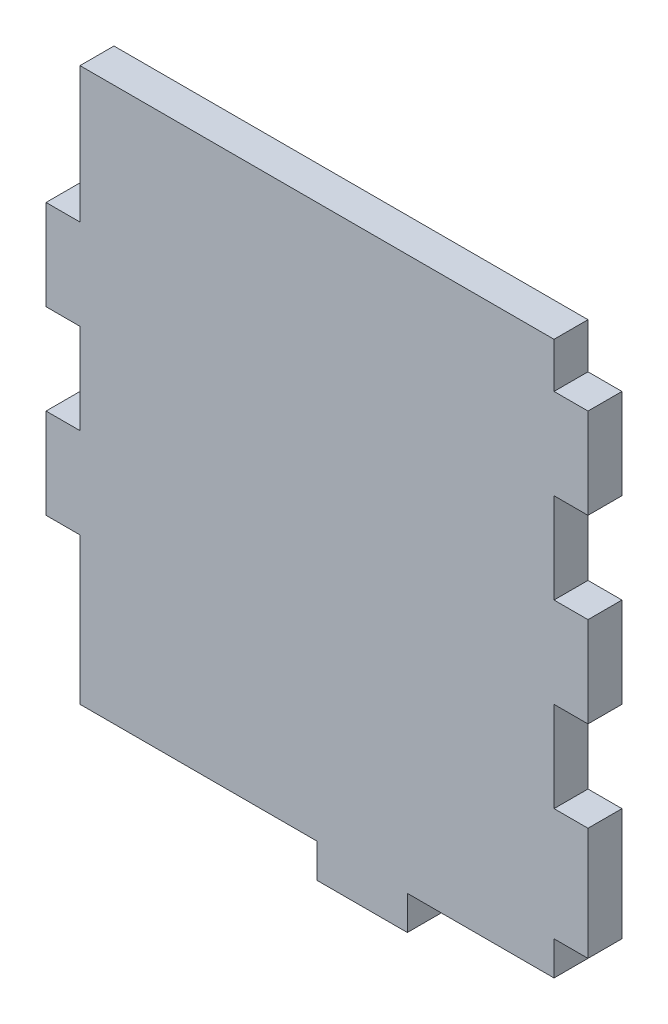
ISO-10303-21;
HEADER;
FILE_DESCRIPTION(('STEP AP214'),'2;1');
FILE_NAME('part.step','',(''),(''),'','','');
FILE_SCHEMA(('AUTOMOTIVE_DESIGN { 1 0 10303 214 1 1 1 1 }'));
ENDSEC;
DATA;
#1=APPLICATION_CONTEXT('core data for automotive mechanical design processes');
#2=APPLICATION_PROTOCOL_DEFINITION('international standard','automotive_design',2000,#1);
#3=PRODUCT_CONTEXT('',#1,'mechanical');
#4=PRODUCT('Part','Part','',(#3));
#5=PRODUCT_RELATED_PRODUCT_CATEGORY('part','',(#4));
#6=PRODUCT_DEFINITION_FORMATION('','',#4);
#7=PRODUCT_DEFINITION_CONTEXT('part definition',#1,'design');
#8=PRODUCT_DEFINITION('design','',#6,#7);
#9=PRODUCT_DEFINITION_SHAPE('','',#8);
#10=(LENGTH_UNIT() NAMED_UNIT(*) SI_UNIT(.MILLI.,.METRE.));
#11=(NAMED_UNIT(*) PLANE_ANGLE_UNIT() SI_UNIT($,.RADIAN.));
#12=(NAMED_UNIT(*) SI_UNIT($,.STERADIAN.) SOLID_ANGLE_UNIT());
#13=UNCERTAINTY_MEASURE_WITH_UNIT(LENGTH_MEASURE(1.E-05),#10,'distance_accuracy_value','');
#14=(GEOMETRIC_REPRESENTATION_CONTEXT(3) GLOBAL_UNCERTAINTY_ASSIGNED_CONTEXT((#13)) GLOBAL_UNIT_ASSIGNED_CONTEXT((#10,
#11,#12)) REPRESENTATION_CONTEXT('',''));
#15=CARTESIAN_POINT('',(0.,0.,0.));
#16=DIRECTION('',(0.,0.,1.));
#17=DIRECTION('',(1.,0.,0.));
#18=AXIS2_PLACEMENT_3D('',#15,#16,#17);
#19=CARTESIAN_POINT('',(0.,0.,4.7752));
#20=DIRECTION('',(0.,0.,-1.));
#21=DIRECTION('',(-1.,0.,0.));
#22=AXIS2_PLACEMENT_3D('',#19,#20,#21);
#23=PLANE('',#22);
#24=DIRECTION('',(0.,1.,0.));
#25=VECTOR('',#24,1.);
#26=CARTESIAN_POINT('',(71.4248,0.,4.7752));
#27=LINE('',#26,#25);
#28=CARTESIAN_POINT('',(71.4248,4.7752,4.7752));
#29=VERTEX_POINT('',#28);
#30=CARTESIAN_POINT('',(71.4248,9.5504,4.7752));
#31=VERTEX_POINT('',#30);
#32=EDGE_CURVE('E237',#29,#31,#27,.T.);
#33=ORIENTED_EDGE('',*,*,#32,.T.);
#34=DIRECTION('',(-1.,0.,0.));
#35=VECTOR('',#34,1.);
#36=CARTESIAN_POINT('',(0.,9.5504,4.7752));
#37=LINE('',#36,#35);
#38=CARTESIAN_POINT('',(76.2,9.5504,4.7752));
#39=VERTEX_POINT('',#38);
#40=EDGE_CURVE('E254',#39,#31,#37,.T.);
#41=ORIENTED_EDGE('',*,*,#40,.F.);
#42=DIRECTION('',(0.,1.,0.));
#43=VECTOR('',#42,1.);
#44=CARTESIAN_POINT('',(76.2,0.,4.7752));
#45=LINE('',#44,#43);
#46=CARTESIAN_POINT('',(76.2,25.4,4.7752));
#47=VERTEX_POINT('',#46);
#48=EDGE_CURVE('E55',#39,#47,#45,.T.);
#49=ORIENTED_EDGE('',*,*,#48,.T.);
#50=DIRECTION('',(-1.,0.,0.));
#51=VECTOR('',#50,1.);
#52=CARTESIAN_POINT('',(0.,25.4,4.7752));
#53=LINE('',#52,#51);
#54=CARTESIAN_POINT('',(71.4248,25.4,4.7752));
#55=VERTEX_POINT('',#54);
#56=EDGE_CURVE('E71',#47,#55,#53,.T.);
#57=ORIENTED_EDGE('',*,*,#56,.T.);
#58=DIRECTION('',(0.,1.,0.));
#59=VECTOR('',#58,1.);
#60=CARTESIAN_POINT('',(71.4248,0.,4.7752));
#61=LINE('',#60,#59);
#62=CARTESIAN_POINT('',(71.4248,38.1,4.7752));
#63=VERTEX_POINT('',#62);
#64=EDGE_CURVE('E519',#55,#63,#61,.T.);
#65=ORIENTED_EDGE('',*,*,#64,.T.);
#66=DIRECTION('',(-1.,0.,0.));
#67=VECTOR('',#66,1.);
#68=CARTESIAN_POINT('',(0.,38.1,4.7752));
#69=LINE('',#68,#67);
#70=CARTESIAN_POINT('',(76.2,38.1,4.7752));
#71=VERTEX_POINT('',#70);
#72=EDGE_CURVE('E602',#71,#63,#69,.T.);
#73=ORIENTED_EDGE('',*,*,#72,.F.);
#74=CARTESIAN_POINT('',(76.2,50.8,4.7752));
#75=VERTEX_POINT('',#74);
#76=EDGE_CURVE('E295',#71,#75,#45,.T.);
#77=ORIENTED_EDGE('',*,*,#76,.T.);
#78=DIRECTION('',(-1.,0.,0.));
#79=VECTOR('',#78,1.);
#80=CARTESIAN_POINT('',(0.,50.8,4.7752));
#81=LINE('',#80,#79);
#82=CARTESIAN_POINT('',(71.4248,50.8,4.7752));
#83=VERTEX_POINT('',#82);
#84=EDGE_CURVE('E63',#75,#83,#81,.T.);
#85=ORIENTED_EDGE('',*,*,#84,.T.);
#86=DIRECTION('',(0.,1.,0.));
#87=VECTOR('',#86,1.);
#88=CARTESIAN_POINT('',(71.4248,0.,4.7752));
#89=LINE('',#88,#87);
#90=CARTESIAN_POINT('',(71.4248,63.5,4.7752));
#91=VERTEX_POINT('',#90);
#92=EDGE_CURVE('E503',#83,#91,#89,.T.);
#93=ORIENTED_EDGE('',*,*,#92,.T.);
#94=DIRECTION('',(-1.,0.,0.));
#95=VECTOR('',#94,1.);
#96=CARTESIAN_POINT('',(0.,63.5,4.7752));
#97=LINE('',#96,#95);
#98=CARTESIAN_POINT('',(76.2,63.5,4.7752));
#99=VERTEX_POINT('',#98);
#100=EDGE_CURVE('E501',#99,#91,#97,.T.);
#101=ORIENTED_EDGE('',*,*,#100,.F.);
#102=CARTESIAN_POINT('',(76.2,76.2,4.7752));
#103=VERTEX_POINT('',#102);
#104=EDGE_CURVE('E292',#99,#103,#45,.T.);
#105=ORIENTED_EDGE('',*,*,#104,.T.);
#106=DIRECTION('',(-1.,0.,0.));
#107=VECTOR('',#106,1.);
#108=CARTESIAN_POINT('',(0.,76.2,4.7752));
#109=LINE('',#108,#107);
#110=CARTESIAN_POINT('',(71.4248,76.2,4.7752));
#111=VERTEX_POINT('',#110);
#112=EDGE_CURVE('E498',#103,#111,#109,.T.);
#113=ORIENTED_EDGE('',*,*,#112,.T.);
#114=DIRECTION('',(0.,1.,0.));
#115=VECTOR('',#114,1.);
#116=CARTESIAN_POINT('',(71.4248,0.,4.7752));
#117=LINE('',#116,#115);
#118=CARTESIAN_POINT('',(71.4248,82.55,4.7752));
#119=VERTEX_POINT('',#118);
#120=EDGE_CURVE('E536',#111,#119,#117,.T.);
#121=ORIENTED_EDGE('',*,*,#120,.T.);
#122=DIRECTION('',(-1.,0.,0.));
#123=VECTOR('',#122,1.);
#124=CARTESIAN_POINT('',(0.,82.55,4.7752));
#125=LINE('',#124,#123);
#126=CARTESIAN_POINT('',(4.77520000000001,82.55,4.7752));
#127=VERTEX_POINT('',#126);
#128=EDGE_CURVE('E11',#119,#127,#125,.T.);
#129=ORIENTED_EDGE('',*,*,#128,.T.);
#130=DIRECTION('',(0.,1.,0.));
#131=VECTOR('',#130,1.);
#132=CARTESIAN_POINT('',(4.77519999999997,0.,4.7752));
#133=LINE('',#132,#131);
#134=CARTESIAN_POINT('',(4.7752,63.5,4.7752));
#135=VERTEX_POINT('',#134);
#136=EDGE_CURVE('E340',#135,#127,#133,.T.);
#137=ORIENTED_EDGE('',*,*,#136,.F.);
#138=DIRECTION('',(1.,0.,0.));
#139=VECTOR('',#138,1.);
#140=CARTESIAN_POINT('',(0.,63.5,4.7752));
#141=LINE('',#140,#139);
#142=CARTESIAN_POINT('',(0.,63.5,4.7752));
#143=VERTEX_POINT('',#142);
#144=EDGE_CURVE('E354',#143,#135,#141,.T.);
#145=ORIENTED_EDGE('',*,*,#144,.F.);
#146=DIRECTION('',(0.,-1.,0.));
#147=VECTOR('',#146,1.);
#148=CARTESIAN_POINT('',(0.,0.,4.7752));
#149=LINE('',#148,#147);
#150=CARTESIAN_POINT('',(0.,50.8,4.7752));
#151=VERTEX_POINT('',#150);
#152=EDGE_CURVE('E287',#143,#151,#149,.T.);
#153=ORIENTED_EDGE('',*,*,#152,.T.);
#154=DIRECTION('',(1.,0.,0.));
#155=VECTOR('',#154,1.);
#156=CARTESIAN_POINT('',(0.,50.8,4.7752));
#157=LINE('',#156,#155);
#158=CARTESIAN_POINT('',(4.7752,50.8,4.7752));
#159=VERTEX_POINT('',#158);
#160=EDGE_CURVE('E368',#151,#159,#157,.T.);
#161=ORIENTED_EDGE('',*,*,#160,.T.);
#162=DIRECTION('',(0.,1.,0.));
#163=VECTOR('',#162,1.);
#164=CARTESIAN_POINT('',(4.7752,0.,4.7752));
#165=LINE('',#164,#163);
#166=CARTESIAN_POINT('',(4.7752,38.1,4.7752));
#167=VERTEX_POINT('',#166);
#168=EDGE_CURVE('E380',#167,#159,#165,.T.);
#169=ORIENTED_EDGE('',*,*,#168,.F.);
#170=DIRECTION('',(1.,0.,0.));
#171=VECTOR('',#170,1.);
#172=CARTESIAN_POINT('',(0.,38.1,4.7752));
#173=LINE('',#172,#171);
#174=CARTESIAN_POINT('',(0.,38.1,4.7752));
#175=VERTEX_POINT('',#174);
#176=EDGE_CURVE('E376',#175,#167,#173,.T.);
#177=ORIENTED_EDGE('',*,*,#176,.F.);
#178=CARTESIAN_POINT('',(0.,25.4,4.7752));
#179=VERTEX_POINT('',#178);
#180=EDGE_CURVE('E283',#175,#179,#149,.T.);
#181=ORIENTED_EDGE('',*,*,#180,.T.);
#182=DIRECTION('',(1.,0.,0.));
#183=VECTOR('',#182,1.);
#184=CARTESIAN_POINT('',(0.,25.4,4.7752));
#185=LINE('',#184,#183);
#186=CARTESIAN_POINT('',(4.7752,25.4,4.7752));
#187=VERTEX_POINT('',#186);
#188=EDGE_CURVE('E404',#179,#187,#185,.T.);
#189=ORIENTED_EDGE('',*,*,#188,.T.);
#190=DIRECTION('',(0.,1.,0.));
#191=VECTOR('',#190,1.);
#192=CARTESIAN_POINT('',(4.7752,0.,4.7752));
#193=LINE('',#192,#191);
#194=CARTESIAN_POINT('',(4.7752,4.7752,4.7752));
#195=VERTEX_POINT('',#194);
#196=EDGE_CURVE('E408',#195,#187,#193,.T.);
#197=ORIENTED_EDGE('',*,*,#196,.F.);
#198=DIRECTION('',(-1.,0.,0.));
#199=VECTOR('',#198,1.);
#200=CARTESIAN_POINT('',(0.,4.7752,4.7752));
#201=LINE('',#200,#199);
#202=CARTESIAN_POINT('',(38.1,4.7752,4.7752));
#203=VERTEX_POINT('',#202);
#204=EDGE_CURVE('E429',#203,#195,#201,.T.);
#205=ORIENTED_EDGE('',*,*,#204,.F.);
#206=DIRECTION('',(0.,1.,0.));
#207=VECTOR('',#206,1.);
#208=CARTESIAN_POINT('',(38.1,-1.10727030381498E-13,4.7752));
#209=LINE('',#208,#207);
#210=CARTESIAN_POINT('',(38.1,0.,4.7752));
#211=VERTEX_POINT('',#210);
#212=EDGE_CURVE('E280',#211,#203,#209,.T.);
#213=ORIENTED_EDGE('',*,*,#212,.F.);
#214=DIRECTION('',(1.,0.,0.));
#215=VECTOR('',#214,1.);
#216=CARTESIAN_POINT('',(0.,0.,4.7752));
#217=LINE('',#216,#215);
#218=CARTESIAN_POINT('',(50.8,0.,4.7752));
#219=VERTEX_POINT('',#218);
#220=EDGE_CURVE('E288',#211,#219,#217,.T.);
#221=ORIENTED_EDGE('',*,*,#220,.T.);
#222=DIRECTION('',(0.,1.,0.));
#223=VECTOR('',#222,1.);
#224=CARTESIAN_POINT('',(50.8,0.,4.7752));
#225=LINE('',#224,#223);
#226=CARTESIAN_POINT('',(50.8,4.7752,4.7752));
#227=VERTEX_POINT('',#226);
#228=EDGE_CURVE('E261',#219,#227,#225,.T.);
#229=ORIENTED_EDGE('',*,*,#228,.T.);
#230=DIRECTION('',(1.,0.,0.));
#231=VECTOR('',#230,1.);
#232=CARTESIAN_POINT('',(0.,4.7752,4.7752));
#233=LINE('',#232,#231);
#234=EDGE_CURVE('E267',#227,#29,#233,.T.);
#235=ORIENTED_EDGE('',*,*,#234,.T.);
#236=EDGE_LOOP('',(#33,#41,#49,#57,#65,#73,#77,#85,#93,#101,#105,#113,#121,#129,#137,#145,#153,
#161,#169,#177,#181,#189,#197,#205,#213,#221,#229,#235));
#237=FACE_BOUND('',#236,.T.);
#238=ADVANCED_FACE('F45',(#237),#23,.F.);
#239=CARTESIAN_POINT('',(0.,0.,0.));
#240=DIRECTION('',(0.,0.,-1.));
#241=DIRECTION('',(-1.,0.,0.));
#242=AXIS2_PLACEMENT_3D('',#239,#240,#241);
#243=PLANE('',#242);
#244=DIRECTION('',(-1.,0.,0.));
#245=VECTOR('',#244,1.);
#246=CARTESIAN_POINT('',(0.,9.5504,0.));
#247=LINE('',#246,#245);
#248=CARTESIAN_POINT('',(76.2,9.5504,0.));
#249=VERTEX_POINT('',#248);
#250=CARTESIAN_POINT('',(71.4248,9.5504,0.));
#251=VERTEX_POINT('',#250);
#252=EDGE_CURVE('E244',#249,#251,#247,.T.);
#253=ORIENTED_EDGE('',*,*,#252,.T.);
#254=DIRECTION('',(0.,1.,0.));
#255=VECTOR('',#254,1.);
#256=CARTESIAN_POINT('',(71.4248,0.,0.));
#257=LINE('',#256,#255);
#258=CARTESIAN_POINT('',(71.4248,4.7752,0.));
#259=VERTEX_POINT('',#258);
#260=EDGE_CURVE('E234',#259,#251,#257,.T.);
#261=ORIENTED_EDGE('',*,*,#260,.F.);
#262=DIRECTION('',(1.,0.,0.));
#263=VECTOR('',#262,1.);
#264=CARTESIAN_POINT('',(0.,4.7752,0.));
#265=LINE('',#264,#263);
#266=CARTESIAN_POINT('',(50.8,4.7752,0.));
#267=VERTEX_POINT('',#266);
#268=EDGE_CURVE('E251',#267,#259,#265,.T.);
#269=ORIENTED_EDGE('',*,*,#268,.F.);
#270=DIRECTION('',(0.,1.,0.));
#271=VECTOR('',#270,1.);
#272=CARTESIAN_POINT('',(50.8,0.,0.));
#273=LINE('',#272,#271);
#274=CARTESIAN_POINT('',(50.8,0.,0.));
#275=VERTEX_POINT('',#274);
#276=EDGE_CURVE('E260',#275,#267,#273,.T.);
#277=ORIENTED_EDGE('',*,*,#276,.F.);
#278=DIRECTION('',(1.,0.,0.));
#279=VECTOR('',#278,1.);
#280=CARTESIAN_POINT('',(0.,0.,0.));
#281=LINE('',#280,#279);
#282=CARTESIAN_POINT('',(38.1,0.,0.));
#283=VERTEX_POINT('',#282);
#284=EDGE_CURVE('E303',#283,#275,#281,.T.);
#285=ORIENTED_EDGE('',*,*,#284,.F.);
#286=DIRECTION('',(0.,1.,0.));
#287=VECTOR('',#286,1.);
#288=CARTESIAN_POINT('',(38.1,-1.10727030381498E-13,0.));
#289=LINE('',#288,#287);
#290=CARTESIAN_POINT('',(38.1,4.7752,0.));
#291=VERTEX_POINT('',#290);
#292=EDGE_CURVE('E424',#283,#291,#289,.T.);
#293=ORIENTED_EDGE('',*,*,#292,.T.);
#294=DIRECTION('',(-1.,0.,0.));
#295=VECTOR('',#294,1.);
#296=CARTESIAN_POINT('',(0.,4.7752,0.));
#297=LINE('',#296,#295);
#298=CARTESIAN_POINT('',(4.7752,4.7752,0.));
#299=VERTEX_POINT('',#298);
#300=EDGE_CURVE('E428',#291,#299,#297,.T.);
#301=ORIENTED_EDGE('',*,*,#300,.T.);
#302=DIRECTION('',(0.,1.,0.));
#303=VECTOR('',#302,1.);
#304=CARTESIAN_POINT('',(4.7752,0.,0.));
#305=LINE('',#304,#303);
#306=CARTESIAN_POINT('',(4.7752,25.4,0.));
#307=VERTEX_POINT('',#306);
#308=EDGE_CURVE('E399',#299,#307,#305,.T.);
#309=ORIENTED_EDGE('',*,*,#308,.T.);
#310=DIRECTION('',(1.,0.,0.));
#311=VECTOR('',#310,1.);
#312=CARTESIAN_POINT('',(0.,25.4,0.));
#313=LINE('',#312,#311);
#314=CARTESIAN_POINT('',(0.,25.4,0.));
#315=VERTEX_POINT('',#314);
#316=EDGE_CURVE('E403',#315,#307,#313,.T.);
#317=ORIENTED_EDGE('',*,*,#316,.F.);
#318=DIRECTION('',(0.,-1.,0.));
#319=VECTOR('',#318,1.);
#320=CARTESIAN_POINT('',(0.,0.,0.));
#321=LINE('',#320,#319);
#322=CARTESIAN_POINT('',(0.,38.1,0.));
#323=VERTEX_POINT('',#322);
#324=EDGE_CURVE('E297',#323,#315,#321,.T.);
#325=ORIENTED_EDGE('',*,*,#324,.F.);
#326=DIRECTION('',(1.,0.,0.));
#327=VECTOR('',#326,1.);
#328=CARTESIAN_POINT('',(0.,38.1,0.));
#329=LINE('',#328,#327);
#330=CARTESIAN_POINT('',(4.7752,38.1,0.));
#331=VERTEX_POINT('',#330);
#332=EDGE_CURVE('E363',#323,#331,#329,.T.);
#333=ORIENTED_EDGE('',*,*,#332,.T.);
#334=DIRECTION('',(0.,1.,0.));
#335=VECTOR('',#334,1.);
#336=CARTESIAN_POINT('',(4.7752,0.,0.));
#337=LINE('',#336,#335);
#338=CARTESIAN_POINT('',(4.7752,50.8,0.));
#339=VERTEX_POINT('',#338);
#340=EDGE_CURVE('E367',#331,#339,#337,.T.);
#341=ORIENTED_EDGE('',*,*,#340,.T.);
#342=DIRECTION('',(1.,0.,0.));
#343=VECTOR('',#342,1.);
#344=CARTESIAN_POINT('',(0.,50.8,0.));
#345=LINE('',#344,#343);
#346=CARTESIAN_POINT('',(0.,50.8,0.));
#347=VERTEX_POINT('',#346);
#348=EDGE_CURVE('E372',#347,#339,#345,.T.);
#349=ORIENTED_EDGE('',*,*,#348,.F.);
#350=CARTESIAN_POINT('',(0.,63.5,0.));
#351=VERTEX_POINT('',#350);
#352=EDGE_CURVE('E301',#351,#347,#321,.T.);
#353=ORIENTED_EDGE('',*,*,#352,.F.);
#354=DIRECTION('',(1.,0.,0.));
#355=VECTOR('',#354,1.);
#356=CARTESIAN_POINT('',(0.,63.5,0.));
#357=LINE('',#356,#355);
#358=CARTESIAN_POINT('',(4.7752,63.5,0.));
#359=VERTEX_POINT('',#358);
#360=EDGE_CURVE('E345',#351,#359,#357,.T.);
#361=ORIENTED_EDGE('',*,*,#360,.T.);
#362=DIRECTION('',(0.,1.,0.));
#363=VECTOR('',#362,1.);
#364=CARTESIAN_POINT('',(4.77519999999997,0.,0.));
#365=LINE('',#364,#363);
#366=CARTESIAN_POINT('',(4.77520000000001,82.55,0.));
#367=VERTEX_POINT('',#366);
#368=EDGE_CURVE('E337',#359,#367,#365,.T.);
#369=ORIENTED_EDGE('',*,*,#368,.T.);
#370=DIRECTION('',(-1.,0.,0.));
#371=VECTOR('',#370,1.);
#372=CARTESIAN_POINT('',(0.,82.55,0.));
#373=LINE('',#372,#371);
#374=CARTESIAN_POINT('',(71.4248,82.55,0.));
#375=VERTEX_POINT('',#374);
#376=EDGE_CURVE('E49',#375,#367,#373,.T.);
#377=ORIENTED_EDGE('',*,*,#376,.F.);
#378=DIRECTION('',(0.,1.,0.));
#379=VECTOR('',#378,1.);
#380=CARTESIAN_POINT('',(71.4248,0.,0.));
#381=LINE('',#380,#379);
#382=CARTESIAN_POINT('',(71.4248,76.2,0.));
#383=VERTEX_POINT('',#382);
#384=EDGE_CURVE('E529',#383,#375,#381,.T.);
#385=ORIENTED_EDGE('',*,*,#384,.F.);
#386=DIRECTION('',(-1.,0.,0.));
#387=VECTOR('',#386,1.);
#388=CARTESIAN_POINT('',(0.,76.2,0.));
#389=LINE('',#388,#387);
#390=CARTESIAN_POINT('',(76.2,76.2,0.));
#391=VERTEX_POINT('',#390);
#392=EDGE_CURVE('E532',#391,#383,#389,.T.);
#393=ORIENTED_EDGE('',*,*,#392,.F.);
#394=DIRECTION('',(0.,1.,0.));
#395=VECTOR('',#394,1.);
#396=CARTESIAN_POINT('',(76.2,0.,0.));
#397=LINE('',#396,#395);
#398=CARTESIAN_POINT('',(76.2,63.5,0.));
#399=VERTEX_POINT('',#398);
#400=EDGE_CURVE('E306',#399,#391,#397,.T.);
#401=ORIENTED_EDGE('',*,*,#400,.F.);
#402=DIRECTION('',(-1.,0.,0.));
#403=VECTOR('',#402,1.);
#404=CARTESIAN_POINT('',(0.,63.5,0.));
#405=LINE('',#404,#403);
#406=CARTESIAN_POINT('',(71.4248,63.5,0.));
#407=VERTEX_POINT('',#406);
#408=EDGE_CURVE('E528',#399,#407,#405,.T.);
#409=ORIENTED_EDGE('',*,*,#408,.T.);
#410=DIRECTION('',(0.,1.,0.));
#411=VECTOR('',#410,1.);
#412=CARTESIAN_POINT('',(71.4248,0.,0.));
#413=LINE('',#412,#411);
#414=CARTESIAN_POINT('',(71.4248,50.8,0.));
#415=VERTEX_POINT('',#414);
#416=EDGE_CURVE('E507',#415,#407,#413,.T.);
#417=ORIENTED_EDGE('',*,*,#416,.F.);
#418=DIRECTION('',(-1.,0.,0.));
#419=VECTOR('',#418,1.);
#420=CARTESIAN_POINT('',(0.,50.8,0.));
#421=LINE('',#420,#419);
#422=CARTESIAN_POINT('',(76.2,50.8,0.));
#423=VERTEX_POINT('',#422);
#424=EDGE_CURVE('E511',#423,#415,#421,.T.);
#425=ORIENTED_EDGE('',*,*,#424,.F.);
#426=CARTESIAN_POINT('',(76.2,38.1,0.));
#427=VERTEX_POINT('',#426);
#428=EDGE_CURVE('E309',#427,#423,#397,.T.);
#429=ORIENTED_EDGE('',*,*,#428,.F.);
#430=DIRECTION('',(-1.,0.,0.));
#431=VECTOR('',#430,1.);
#432=CARTESIAN_POINT('',(0.,38.1,0.));
#433=LINE('',#432,#431);
#434=CARTESIAN_POINT('',(71.4248,38.1,0.));
#435=VERTEX_POINT('',#434);
#436=EDGE_CURVE('E577',#427,#435,#433,.T.);
#437=ORIENTED_EDGE('',*,*,#436,.T.);
#438=DIRECTION('',(0.,1.,0.));
#439=VECTOR('',#438,1.);
#440=CARTESIAN_POINT('',(71.4248,0.,0.));
#441=LINE('',#440,#439);
#442=CARTESIAN_POINT('',(71.4248,25.4,0.));
#443=VERTEX_POINT('',#442);
#444=EDGE_CURVE('E605',#443,#435,#441,.T.);
#445=ORIENTED_EDGE('',*,*,#444,.F.);
#446=DIRECTION('',(-1.,0.,0.));
#447=VECTOR('',#446,1.);
#448=CARTESIAN_POINT('',(0.,25.4,0.));
#449=LINE('',#448,#447);
#450=CARTESIAN_POINT('',(76.2,25.4,0.));
#451=VERTEX_POINT('',#450);
#452=EDGE_CURVE('E609',#451,#443,#449,.T.);
#453=ORIENTED_EDGE('',*,*,#452,.F.);
#454=EDGE_CURVE('E310',#249,#451,#397,.T.);
#455=ORIENTED_EDGE('',*,*,#454,.F.);
#456=EDGE_LOOP('',(#253,#261,#269,#277,#285,#293,#301,#309,#317,#325,#333,#341,#349,#353,#361,
#369,#377,#385,#393,#401,#409,#417,#425,#429,#437,#445,#453,#455));
#457=FACE_BOUND('',#456,.T.);
#458=ADVANCED_FACE('F249',(#457),#243,.T.);
#459=CARTESIAN_POINT('',(76.2,0.,4.7752));
#460=DIRECTION('',(-1.,0.,0.));
#461=DIRECTION('',(0.,0.,1.));
#462=AXIS2_PLACEMENT_3D('',#459,#460,#461);
#463=PLANE('',#462);
#464=ORIENTED_EDGE('',*,*,#48,.F.);
#465=DIRECTION('',(0.,0.,1.));
#466=VECTOR('',#465,1.);
#467=CARTESIAN_POINT('',(76.2,9.5504,0.));
#468=LINE('',#467,#466);
#469=EDGE_CURVE('E243',#249,#39,#468,.T.);
#470=ORIENTED_EDGE('',*,*,#469,.F.);
#471=ORIENTED_EDGE('',*,*,#454,.T.);
#472=DIRECTION('',(0.,0.,1.));
#473=VECTOR('',#472,1.);
#474=CARTESIAN_POINT('',(76.2,25.4,0.));
#475=LINE('',#474,#473);
#476=EDGE_CURVE('E567',#451,#47,#475,.T.);
#477=ORIENTED_EDGE('',*,*,#476,.T.);
#478=EDGE_LOOP('',(#464,#470,#471,#477));
#479=FACE_BOUND('',#478,.T.);
#480=ADVANCED_FACE('F476',(#479),#463,.F.);
#481=ORIENTED_EDGE('',*,*,#76,.F.);
#482=DIRECTION('',(0.,0.,1.));
#483=VECTOR('',#482,1.);
#484=CARTESIAN_POINT('',(76.2,38.1,0.));
#485=LINE('',#484,#483);
#486=EDGE_CURVE('E570',#427,#71,#485,.T.);
#487=ORIENTED_EDGE('',*,*,#486,.F.);
#488=ORIENTED_EDGE('',*,*,#428,.T.);
#489=DIRECTION('',(0.,0.,1.));
#490=VECTOR('',#489,1.);
#491=CARTESIAN_POINT('',(76.2,50.8,0.));
#492=LINE('',#491,#490);
#493=EDGE_CURVE('E522',#423,#75,#492,.T.);
#494=ORIENTED_EDGE('',*,*,#493,.T.);
#495=EDGE_LOOP('',(#481,#487,#488,#494));
#496=FACE_BOUND('',#495,.T.);
#497=ADVANCED_FACE('F483',(#496),#463,.F.);
#498=ORIENTED_EDGE('',*,*,#104,.F.);
#499=DIRECTION('',(0.,0.,1.));
#500=VECTOR('',#499,1.);
#501=CARTESIAN_POINT('',(76.2,63.5,0.));
#502=LINE('',#501,#500);
#503=EDGE_CURVE('E493',#399,#99,#502,.T.);
#504=ORIENTED_EDGE('',*,*,#503,.F.);
#505=ORIENTED_EDGE('',*,*,#400,.T.);
#506=DIRECTION('',(0.,0.,1.));
#507=VECTOR('',#506,1.);
#508=CARTESIAN_POINT('',(76.2,76.2,0.));
#509=LINE('',#508,#507);
#510=EDGE_CURVE('E494',#391,#103,#509,.T.);
#511=ORIENTED_EDGE('',*,*,#510,.T.);
#512=EDGE_LOOP('',(#498,#504,#505,#511));
#513=FACE_BOUND('',#512,.T.);
#514=ADVANCED_FACE('F481',(#513),#463,.F.);
#515=CARTESIAN_POINT('',(0.,82.55,4.7752));
#516=DIRECTION('',(0.,-1.,0.));
#517=DIRECTION('',(0.,0.,-1.));
#518=AXIS2_PLACEMENT_3D('',#515,#516,#517);
#519=PLANE('',#518);
#520=DIRECTION('',(0.,0.,1.));
#521=VECTOR('',#520,1.);
#522=CARTESIAN_POINT('',(71.4248,82.55,0.));
#523=LINE('',#522,#521);
#524=EDGE_CURVE('E330',#375,#119,#523,.T.);
#525=ORIENTED_EDGE('',*,*,#524,.F.);
#526=ORIENTED_EDGE('',*,*,#376,.T.);
#527=DIRECTION('',(0.,0.,1.));
#528=VECTOR('',#527,1.);
#529=CARTESIAN_POINT('',(4.77520000000001,82.55,0.));
#530=LINE('',#529,#528);
#531=EDGE_CURVE('E329',#367,#127,#530,.T.);
#532=ORIENTED_EDGE('',*,*,#531,.T.);
#533=ORIENTED_EDGE('',*,*,#128,.F.);
#534=EDGE_LOOP('',(#525,#526,#532,#533));
#535=FACE_BOUND('',#534,.T.);
#536=ADVANCED_FACE('F327',(#535),#519,.F.);
#537=CARTESIAN_POINT('',(0.,4.7752,0.));
#538=DIRECTION('',(0.,-1.,0.));
#539=DIRECTION('',(0.,0.,-1.));
#540=AXIS2_PLACEMENT_3D('',#537,#538,#539);
#541=PLANE('',#540);
#542=ORIENTED_EDGE('',*,*,#268,.T.);
#543=DIRECTION('',(0.,0.,1.));
#544=VECTOR('',#543,1.);
#545=CARTESIAN_POINT('',(71.4248,4.7752,0.));
#546=LINE('',#545,#544);
#547=EDGE_CURVE('E231',#259,#29,#546,.T.);
#548=ORIENTED_EDGE('',*,*,#547,.T.);
#549=ORIENTED_EDGE('',*,*,#234,.F.);
#550=DIRECTION('',(0.,0.,1.));
#551=VECTOR('',#550,1.);
#552=CARTESIAN_POINT('',(50.8,4.7752,0.));
#553=LINE('',#552,#551);
#554=EDGE_CURVE('E258',#267,#227,#553,.T.);
#555=ORIENTED_EDGE('',*,*,#554,.F.);
#556=EDGE_LOOP('',(#542,#548,#549,#555));
#557=FACE_BOUND('',#556,.T.);
#558=ADVANCED_FACE('F257',(#557),#541,.T.);
#559=CARTESIAN_POINT('',(0.,0.,4.7752));
#560=DIRECTION('',(1.,0.,0.));
#561=DIRECTION('',(0.,0.,-1.));
#562=AXIS2_PLACEMENT_3D('',#559,#560,#561);
#563=PLANE('',#562);
#564=ORIENTED_EDGE('',*,*,#152,.F.);
#565=DIRECTION('',(0.,0.,1.));
#566=VECTOR('',#565,1.);
#567=CARTESIAN_POINT('',(0.,63.5,0.));
#568=LINE('',#567,#566);
#569=EDGE_CURVE('E274',#351,#143,#568,.T.);
#570=ORIENTED_EDGE('',*,*,#569,.F.);
#571=ORIENTED_EDGE('',*,*,#352,.T.);
#572=DIRECTION('',(0.,0.,1.));
#573=VECTOR('',#572,1.);
#574=CARTESIAN_POINT('',(0.,50.8,0.));
#575=LINE('',#574,#573);
#576=EDGE_CURVE('E390',#347,#151,#575,.T.);
#577=ORIENTED_EDGE('',*,*,#576,.T.);
#578=EDGE_LOOP('',(#564,#570,#571,#577));
#579=FACE_BOUND('',#578,.T.);
#580=ADVANCED_FACE('F47',(#579),#563,.F.);
#581=ORIENTED_EDGE('',*,*,#180,.F.);
#582=DIRECTION('',(0.,0.,1.));
#583=VECTOR('',#582,1.);
#584=CARTESIAN_POINT('',(0.,38.1,0.));
#585=LINE('',#584,#583);
#586=EDGE_CURVE('E358',#323,#175,#585,.T.);
#587=ORIENTED_EDGE('',*,*,#586,.F.);
#588=ORIENTED_EDGE('',*,*,#324,.T.);
#589=DIRECTION('',(0.,0.,1.));
#590=VECTOR('',#589,1.);
#591=CARTESIAN_POINT('',(0.,25.4,0.));
#592=LINE('',#591,#590);
#593=EDGE_CURVE('E381',#315,#179,#592,.T.);
#594=ORIENTED_EDGE('',*,*,#593,.T.);
#595=EDGE_LOOP('',(#581,#587,#588,#594));
#596=FACE_BOUND('',#595,.T.);
#597=ADVANCED_FACE('F468',(#596),#563,.F.);
#598=CARTESIAN_POINT('',(0.,0.,4.7752));
#599=DIRECTION('',(0.,1.,0.));
#600=DIRECTION('',(0.,0.,1.));
#601=AXIS2_PLACEMENT_3D('',#598,#599,#600);
#602=PLANE('',#601);
#603=ORIENTED_EDGE('',*,*,#220,.F.);
#604=DIRECTION('',(0.,0.,1.));
#605=VECTOR('',#604,1.);
#606=CARTESIAN_POINT('',(38.1,0.,0.));
#607=LINE('',#606,#605);
#608=EDGE_CURVE('E302',#283,#211,#607,.T.);
#609=ORIENTED_EDGE('',*,*,#608,.F.);
#610=ORIENTED_EDGE('',*,*,#284,.T.);
#611=DIRECTION('',(0.,0.,1.));
#612=VECTOR('',#611,1.);
#613=CARTESIAN_POINT('',(50.8,0.,0.));
#614=LINE('',#613,#612);
#615=EDGE_CURVE('E276',#275,#219,#614,.T.);
#616=ORIENTED_EDGE('',*,*,#615,.T.);
#617=EDGE_LOOP('',(#603,#609,#610,#616));
#618=FACE_BOUND('',#617,.T.);
#619=ADVANCED_FACE('F458',(#618),#602,.F.);
#620=CARTESIAN_POINT('',(50.8,0.,0.));
#621=DIRECTION('',(1.,0.,0.));
#622=DIRECTION('',(0.,0.,-1.));
#623=AXIS2_PLACEMENT_3D('',#620,#621,#622);
#624=PLANE('',#623);
#625=ORIENTED_EDGE('',*,*,#228,.F.);
#626=ORIENTED_EDGE('',*,*,#615,.F.);
#627=ORIENTED_EDGE('',*,*,#276,.T.);
#628=ORIENTED_EDGE('',*,*,#554,.T.);
#629=EDGE_LOOP('',(#625,#626,#627,#628));
#630=FACE_BOUND('',#629,.T.);
#631=ADVANCED_FACE('F460',(#630),#624,.T.);
#632=CARTESIAN_POINT('',(38.1,-1.10727030381498E-13,0.));
#633=DIRECTION('',(1.,0.,0.));
#634=DIRECTION('',(0.,1.,0.));
#635=AXIS2_PLACEMENT_3D('',#632,#633,#634);
#636=PLANE('',#635);
#637=ORIENTED_EDGE('',*,*,#212,.T.);
#638=DIRECTION('',(0.,0.,1.));
#639=VECTOR('',#638,1.);
#640=CARTESIAN_POINT('',(38.1,4.7752,0.));
#641=LINE('',#640,#639);
#642=EDGE_CURVE('E270',#291,#203,#641,.T.);
#643=ORIENTED_EDGE('',*,*,#642,.F.);
#644=ORIENTED_EDGE('',*,*,#292,.F.);
#645=ORIENTED_EDGE('',*,*,#608,.T.);
#646=EDGE_LOOP('',(#637,#643,#644,#645));
#647=FACE_BOUND('',#646,.T.);
#648=ADVANCED_FACE('F448',(#647),#636,.F.);
#649=CARTESIAN_POINT('',(0.,4.7752,0.));
#650=DIRECTION('',(0.,1.,0.));
#651=DIRECTION('',(-1.,0.,0.));
#652=AXIS2_PLACEMENT_3D('',#649,#650,#651);
#653=PLANE('',#652);
#654=ORIENTED_EDGE('',*,*,#204,.T.);
#655=DIRECTION('',(0.,0.,1.));
#656=VECTOR('',#655,1.);
#657=CARTESIAN_POINT('',(4.7752,4.7752,0.));
#658=LINE('',#657,#656);
#659=EDGE_CURVE('E407',#299,#195,#658,.T.);
#660=ORIENTED_EDGE('',*,*,#659,.F.);
#661=ORIENTED_EDGE('',*,*,#300,.F.);
#662=ORIENTED_EDGE('',*,*,#642,.T.);
#663=EDGE_LOOP('',(#654,#660,#661,#662));
#664=FACE_BOUND('',#663,.T.);
#665=ADVANCED_FACE('F445',(#664),#653,.F.);
#666=CARTESIAN_POINT('',(0.,25.4,0.));
#667=DIRECTION('',(0.,-1.,0.));
#668=DIRECTION('',(0.,0.,-1.));
#669=AXIS2_PLACEMENT_3D('',#666,#667,#668);
#670=PLANE('',#669);
#671=ORIENTED_EDGE('',*,*,#188,.F.);
#672=ORIENTED_EDGE('',*,*,#593,.F.);
#673=ORIENTED_EDGE('',*,*,#316,.T.);
#674=DIRECTION('',(0.,0.,1.));
#675=VECTOR('',#674,1.);
#676=CARTESIAN_POINT('',(4.7752,25.4,0.));
#677=LINE('',#676,#675);
#678=EDGE_CURVE('E419',#307,#187,#677,.T.);
#679=ORIENTED_EDGE('',*,*,#678,.T.);
#680=EDGE_LOOP('',(#671,#672,#673,#679));
#681=FACE_BOUND('',#680,.T.);
#682=ADVANCED_FACE('F670',(#681),#670,.T.);
#683=CARTESIAN_POINT('',(4.7752,0.,0.));
#684=DIRECTION('',(1.,0.,0.));
#685=DIRECTION('',(0.,0.,-1.));
#686=AXIS2_PLACEMENT_3D('',#683,#684,#685);
#687=PLANE('',#686);
#688=ORIENTED_EDGE('',*,*,#196,.T.);
#689=ORIENTED_EDGE('',*,*,#678,.F.);
#690=ORIENTED_EDGE('',*,*,#308,.F.);
#691=ORIENTED_EDGE('',*,*,#659,.T.);
#692=EDGE_LOOP('',(#688,#689,#690,#691));
#693=FACE_BOUND('',#692,.T.);
#694=ADVANCED_FACE('F454',(#693),#687,.F.);
#695=CARTESIAN_POINT('',(0.,63.5,0.));
#696=DIRECTION('',(0.,-1.,0.));
#697=DIRECTION('',(0.,0.,-1.));
#698=AXIS2_PLACEMENT_3D('',#695,#696,#697);
#699=PLANE('',#698);
#700=ORIENTED_EDGE('',*,*,#144,.T.);
#701=DIRECTION('',(0.,0.,1.));
#702=VECTOR('',#701,1.);
#703=CARTESIAN_POINT('',(4.7752,63.5,0.));
#704=LINE('',#703,#702);
#705=EDGE_CURVE('E342',#359,#135,#704,.T.);
#706=ORIENTED_EDGE('',*,*,#705,.F.);
#707=ORIENTED_EDGE('',*,*,#360,.F.);
#708=ORIENTED_EDGE('',*,*,#569,.T.);
#709=EDGE_LOOP('',(#700,#706,#707,#708));
#710=FACE_BOUND('',#709,.T.);
#711=ADVANCED_FACE('F657',(#710),#699,.F.);
#712=CARTESIAN_POINT('',(4.77519999999997,0.,0.));
#713=DIRECTION('',(1.,0.,0.));
#714=DIRECTION('',(0.,1.,0.));
#715=AXIS2_PLACEMENT_3D('',#712,#713,#714);
#716=PLANE('',#715);
#717=ORIENTED_EDGE('',*,*,#136,.T.);
#718=ORIENTED_EDGE('',*,*,#531,.F.);
#719=ORIENTED_EDGE('',*,*,#368,.F.);
#720=ORIENTED_EDGE('',*,*,#705,.T.);
#721=EDGE_LOOP('',(#717,#718,#719,#720));
#722=FACE_BOUND('',#721,.T.);
#723=ADVANCED_FACE('F336',(#722),#716,.F.);
#724=CARTESIAN_POINT('',(0.,38.1,0.));
#725=DIRECTION('',(0.,-1.,0.));
#726=DIRECTION('',(0.,0.,-1.));
#727=AXIS2_PLACEMENT_3D('',#724,#725,#726);
#728=PLANE('',#727);
#729=ORIENTED_EDGE('',*,*,#176,.T.);
#730=DIRECTION('',(0.,0.,1.));
#731=VECTOR('',#730,1.);
#732=CARTESIAN_POINT('',(4.7752,38.1,0.));
#733=LINE('',#732,#731);
#734=EDGE_CURVE('E375',#331,#167,#733,.T.);
#735=ORIENTED_EDGE('',*,*,#734,.F.);
#736=ORIENTED_EDGE('',*,*,#332,.F.);
#737=ORIENTED_EDGE('',*,*,#586,.T.);
#738=EDGE_LOOP('',(#729,#735,#736,#737));
#739=FACE_BOUND('',#738,.T.);
#740=ADVANCED_FACE('F656',(#739),#728,.F.);
#741=CARTESIAN_POINT('',(0.,50.8,0.));
#742=DIRECTION('',(0.,-1.,0.));
#743=DIRECTION('',(0.,0.,-1.));
#744=AXIS2_PLACEMENT_3D('',#741,#742,#743);
#745=PLANE('',#744);
#746=ORIENTED_EDGE('',*,*,#160,.F.);
#747=ORIENTED_EDGE('',*,*,#576,.F.);
#748=ORIENTED_EDGE('',*,*,#348,.T.);
#749=DIRECTION('',(0.,0.,1.));
#750=VECTOR('',#749,1.);
#751=CARTESIAN_POINT('',(4.7752,50.8,0.));
#752=LINE('',#751,#750);
#753=EDGE_CURVE('E394',#339,#159,#752,.T.);
#754=ORIENTED_EDGE('',*,*,#753,.T.);
#755=EDGE_LOOP('',(#746,#747,#748,#754));
#756=FACE_BOUND('',#755,.T.);
#757=ADVANCED_FACE('F660',(#756),#745,.T.);
#758=CARTESIAN_POINT('',(4.7752,0.,0.));
#759=DIRECTION('',(1.,0.,0.));
#760=DIRECTION('',(0.,0.,-1.));
#761=AXIS2_PLACEMENT_3D('',#758,#759,#760);
#762=PLANE('',#761);
#763=ORIENTED_EDGE('',*,*,#168,.T.);
#764=ORIENTED_EDGE('',*,*,#753,.F.);
#765=ORIENTED_EDGE('',*,*,#340,.F.);
#766=ORIENTED_EDGE('',*,*,#734,.T.);
#767=EDGE_LOOP('',(#763,#764,#765,#766));
#768=FACE_BOUND('',#767,.T.);
#769=ADVANCED_FACE('F663',(#768),#762,.F.);
#770=CARTESIAN_POINT('',(71.4248,0.,0.));
#771=DIRECTION('',(1.,0.,0.));
#772=DIRECTION('',(0.,0.,-1.));
#773=AXIS2_PLACEMENT_3D('',#770,#771,#772);
#774=PLANE('',#773);
#775=ORIENTED_EDGE('',*,*,#32,.F.);
#776=ORIENTED_EDGE('',*,*,#547,.F.);
#777=ORIENTED_EDGE('',*,*,#260,.T.);
#778=DIRECTION('',(0.,0.,1.));
#779=VECTOR('',#778,1.);
#780=CARTESIAN_POINT('',(71.4248,9.5504,0.));
#781=LINE('',#780,#779);
#782=EDGE_CURVE('E412',#251,#31,#781,.T.);
#783=ORIENTED_EDGE('',*,*,#782,.T.);
#784=EDGE_LOOP('',(#775,#776,#777,#783));
#785=FACE_BOUND('',#784,.T.);
#786=ADVANCED_FACE('F233',(#785),#774,.T.);
#787=CARTESIAN_POINT('',(0.,9.5504,0.));
#788=DIRECTION('',(0.,1.,0.));
#789=DIRECTION('',(0.,0.,1.));
#790=AXIS2_PLACEMENT_3D('',#787,#788,#789);
#791=PLANE('',#790);
#792=ORIENTED_EDGE('',*,*,#40,.T.);
#793=ORIENTED_EDGE('',*,*,#782,.F.);
#794=ORIENTED_EDGE('',*,*,#252,.F.);
#795=ORIENTED_EDGE('',*,*,#469,.T.);
#796=EDGE_LOOP('',(#792,#793,#794,#795));
#797=FACE_BOUND('',#796,.T.);
#798=ADVANCED_FACE('F653',(#797),#791,.F.);
#799=CARTESIAN_POINT('',(71.4248,0.,0.));
#800=DIRECTION('',(1.,0.,0.));
#801=DIRECTION('',(0.,0.,-1.));
#802=AXIS2_PLACEMENT_3D('',#799,#800,#801);
#803=PLANE('',#802);
#804=ORIENTED_EDGE('',*,*,#120,.F.);
#805=DIRECTION('',(0.,0.,1.));
#806=VECTOR('',#805,1.);
#807=CARTESIAN_POINT('',(71.4248,76.2,0.));
#808=LINE('',#807,#806);
#809=EDGE_CURVE('E535',#383,#111,#808,.T.);
#810=ORIENTED_EDGE('',*,*,#809,.F.);
#811=ORIENTED_EDGE('',*,*,#384,.T.);
#812=ORIENTED_EDGE('',*,*,#524,.T.);
#813=EDGE_LOOP('',(#804,#810,#811,#812));
#814=FACE_BOUND('',#813,.T.);
#815=ADVANCED_FACE('F551',(#814),#803,.T.);
#816=CARTESIAN_POINT('',(0.,76.2,0.));
#817=DIRECTION('',(0.,1.,0.));
#818=DIRECTION('',(0.,0.,1.));
#819=AXIS2_PLACEMENT_3D('',#816,#817,#818);
#820=PLANE('',#819);
#821=ORIENTED_EDGE('',*,*,#112,.F.);
#822=ORIENTED_EDGE('',*,*,#510,.F.);
#823=ORIENTED_EDGE('',*,*,#392,.T.);
#824=ORIENTED_EDGE('',*,*,#809,.T.);
#825=EDGE_LOOP('',(#821,#822,#823,#824));
#826=FACE_BOUND('',#825,.T.);
#827=ADVANCED_FACE('F548',(#826),#820,.T.);
#828=CARTESIAN_POINT('',(71.4248,0.,0.));
#829=DIRECTION('',(1.,0.,0.));
#830=DIRECTION('',(0.,0.,-1.));
#831=AXIS2_PLACEMENT_3D('',#828,#829,#830);
#832=PLANE('',#831);
#833=ORIENTED_EDGE('',*,*,#92,.F.);
#834=DIRECTION('',(0.,0.,1.));
#835=VECTOR('',#834,1.);
#836=CARTESIAN_POINT('',(71.4248,50.8,0.));
#837=LINE('',#836,#835);
#838=EDGE_CURVE('E525',#415,#83,#837,.T.);
#839=ORIENTED_EDGE('',*,*,#838,.F.);
#840=ORIENTED_EDGE('',*,*,#416,.T.);
#841=DIRECTION('',(0.,0.,1.));
#842=VECTOR('',#841,1.);
#843=CARTESIAN_POINT('',(71.4248,63.5,0.));
#844=LINE('',#843,#842);
#845=EDGE_CURVE('E516',#407,#91,#844,.T.);
#846=ORIENTED_EDGE('',*,*,#845,.T.);
#847=EDGE_LOOP('',(#833,#839,#840,#846));
#848=FACE_BOUND('',#847,.T.);
#849=ADVANCED_FACE('F590',(#848),#832,.T.);
#850=CARTESIAN_POINT('',(0.,63.5,0.));
#851=DIRECTION('',(0.,1.,0.));
#852=DIRECTION('',(0.,0.,1.));
#853=AXIS2_PLACEMENT_3D('',#850,#851,#852);
#854=PLANE('',#853);
#855=ORIENTED_EDGE('',*,*,#100,.T.);
#856=ORIENTED_EDGE('',*,*,#845,.F.);
#857=ORIENTED_EDGE('',*,*,#408,.F.);
#858=ORIENTED_EDGE('',*,*,#503,.T.);
#859=EDGE_LOOP('',(#855,#856,#857,#858));
#860=FACE_BOUND('',#859,.T.);
#861=ADVANCED_FACE('F588',(#860),#854,.F.);
#862=CARTESIAN_POINT('',(0.,50.8,0.));
#863=DIRECTION('',(0.,1.,0.));
#864=DIRECTION('',(0.,0.,1.));
#865=AXIS2_PLACEMENT_3D('',#862,#863,#864);
#866=PLANE('',#865);
#867=ORIENTED_EDGE('',*,*,#84,.F.);
#868=ORIENTED_EDGE('',*,*,#493,.F.);
#869=ORIENTED_EDGE('',*,*,#424,.T.);
#870=ORIENTED_EDGE('',*,*,#838,.T.);
#871=EDGE_LOOP('',(#867,#868,#869,#870));
#872=FACE_BOUND('',#871,.T.);
#873=ADVANCED_FACE('F592',(#872),#866,.T.);
#874=CARTESIAN_POINT('',(71.4248,0.,0.));
#875=DIRECTION('',(1.,0.,0.));
#876=DIRECTION('',(0.,0.,-1.));
#877=AXIS2_PLACEMENT_3D('',#874,#875,#876);
#878=PLANE('',#877);
#879=ORIENTED_EDGE('',*,*,#64,.F.);
#880=DIRECTION('',(0.,0.,1.));
#881=VECTOR('',#880,1.);
#882=CARTESIAN_POINT('',(71.4248,25.4,0.));
#883=LINE('',#882,#881);
#884=EDGE_CURVE('E571',#443,#55,#883,.T.);
#885=ORIENTED_EDGE('',*,*,#884,.F.);
#886=ORIENTED_EDGE('',*,*,#444,.T.);
#887=DIRECTION('',(0.,0.,1.));
#888=VECTOR('',#887,1.);
#889=CARTESIAN_POINT('',(71.4248,38.1,0.));
#890=LINE('',#889,#888);
#891=EDGE_CURVE('E575',#435,#63,#890,.T.);
#892=ORIENTED_EDGE('',*,*,#891,.T.);
#893=EDGE_LOOP('',(#879,#885,#886,#892));
#894=FACE_BOUND('',#893,.T.);
#895=ADVANCED_FACE('F631',(#894),#878,.T.);
#896=CARTESIAN_POINT('',(0.,38.1,0.));
#897=DIRECTION('',(0.,1.,0.));
#898=DIRECTION('',(0.,0.,1.));
#899=AXIS2_PLACEMENT_3D('',#896,#897,#898);
#900=PLANE('',#899);
#901=ORIENTED_EDGE('',*,*,#72,.T.);
#902=ORIENTED_EDGE('',*,*,#891,.F.);
#903=ORIENTED_EDGE('',*,*,#436,.F.);
#904=ORIENTED_EDGE('',*,*,#486,.T.);
#905=EDGE_LOOP('',(#901,#902,#903,#904));
#906=FACE_BOUND('',#905,.T.);
#907=ADVANCED_FACE('F600',(#906),#900,.F.);
#908=CARTESIAN_POINT('',(0.,25.4,0.));
#909=DIRECTION('',(0.,1.,0.));
#910=DIRECTION('',(0.,0.,1.));
#911=AXIS2_PLACEMENT_3D('',#908,#909,#910);
#912=PLANE('',#911);
#913=ORIENTED_EDGE('',*,*,#56,.F.);
#914=ORIENTED_EDGE('',*,*,#476,.F.);
#915=ORIENTED_EDGE('',*,*,#452,.T.);
#916=ORIENTED_EDGE('',*,*,#884,.T.);
#917=EDGE_LOOP('',(#913,#914,#915,#916));
#918=FACE_BOUND('',#917,.T.);
#919=ADVANCED_FACE('F632',(#918),#912,.T.);
#920=CLOSED_SHELL('',(#238,#458,#480,#497,#514,#536,#558,#580,#597,#619,#631,#648,#665,#682,
#694,#711,#723,#740,#757,#769,#786,#798,#815,#827,#849,#861,#873,#895,#907,#919));
#921=MANIFOLD_SOLID_BREP('B2',#920);
#922=ADVANCED_BREP_SHAPE_REPRESENTATION('',(#18,#921),#14);
#923=SHAPE_DEFINITION_REPRESENTATION(#9,#922);
ENDSEC;
END-ISO-10303-21;
